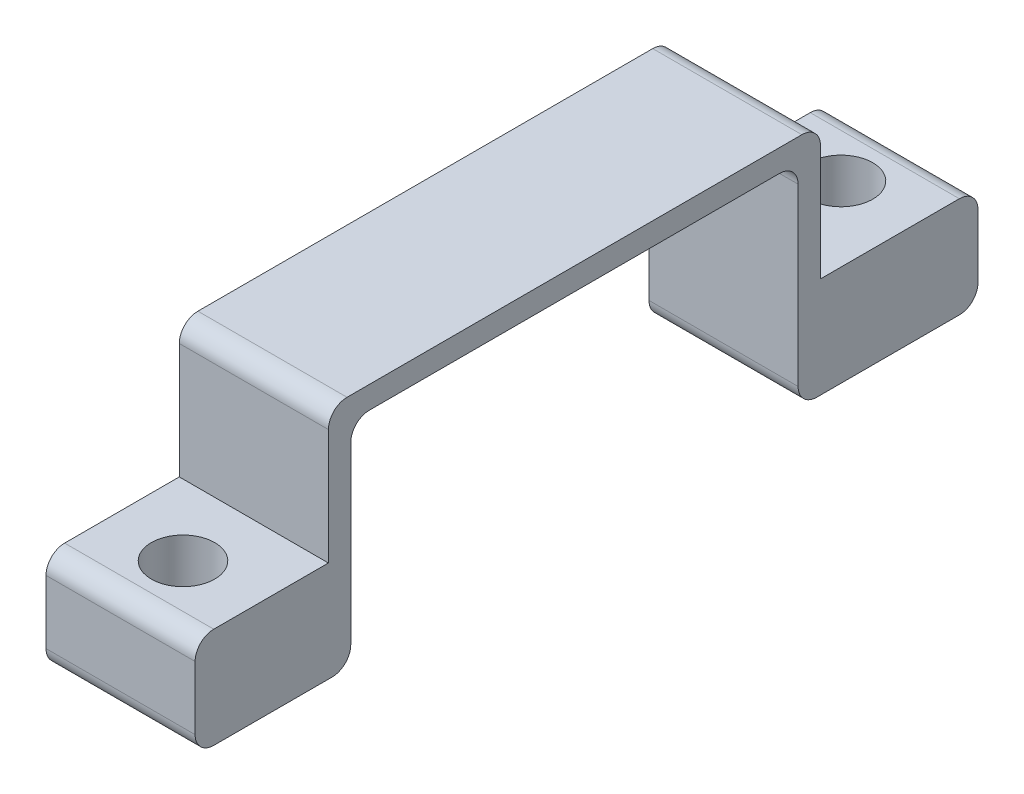
ISO-10303-21;
HEADER;
FILE_DESCRIPTION(('STEP AP214'),'2;1');
FILE_NAME('part.step','',(''),(''),'','','');
FILE_SCHEMA(('AUTOMOTIVE_DESIGN { 1 0 10303 214 1 1 1 1 }'));
ENDSEC;
DATA;
#1=APPLICATION_CONTEXT('core data for automotive mechanical design processes');
#2=APPLICATION_PROTOCOL_DEFINITION('international standard','automotive_design',2000,#1);
#3=PRODUCT_CONTEXT('',#1,'mechanical');
#4=PRODUCT('Part','Part','',(#3));
#5=PRODUCT_RELATED_PRODUCT_CATEGORY('part','',(#4));
#6=PRODUCT_DEFINITION_FORMATION('','',#4);
#7=PRODUCT_DEFINITION_CONTEXT('part definition',#1,'design');
#8=PRODUCT_DEFINITION('design','',#6,#7);
#9=PRODUCT_DEFINITION_SHAPE('','',#8);
#10=(LENGTH_UNIT() NAMED_UNIT(*) SI_UNIT(.MILLI.,.METRE.));
#11=(NAMED_UNIT(*) PLANE_ANGLE_UNIT() SI_UNIT($,.RADIAN.));
#12=(NAMED_UNIT(*) SI_UNIT($,.STERADIAN.) SOLID_ANGLE_UNIT());
#13=UNCERTAINTY_MEASURE_WITH_UNIT(LENGTH_MEASURE(1.E-05),#10,'distance_accuracy_value','');
#14=(GEOMETRIC_REPRESENTATION_CONTEXT(3) GLOBAL_UNCERTAINTY_ASSIGNED_CONTEXT((#13)) GLOBAL_UNIT_ASSIGNED_CONTEXT((#10,
#11,#12)) REPRESENTATION_CONTEXT('',''));
#15=CARTESIAN_POINT('',(0.,0.,0.));
#16=DIRECTION('',(0.,0.,1.));
#17=DIRECTION('',(1.,0.,0.));
#18=AXIS2_PLACEMENT_3D('',#15,#16,#17);
#19=CARTESIAN_POINT('',(-32.5,15.3,102.65));
#20=DIRECTION('',(0.,-1.,0.));
#21=DIRECTION('',(0.,0.,-1.));
#22=AXIS2_PLACEMENT_3D('',#19,#20,#21);
#23=PLANE('',#22);
#24=CARTESIAN_POINT('',(-21.9999999999999,15.3,96.3499999999999));
#25=DIRECTION('',(0.,-1.,0.));
#26=DIRECTION('',(0.,0.,-1.));
#27=AXIS2_PLACEMENT_3D('',#24,#25,#26);
#28=CIRCLE('',#27,1.7);
#29=CARTESIAN_POINT('',(-21.9999999999999,15.3,94.6499999999999));
#30=VERTEX_POINT('',#29);
#31=EDGE_CURVE('E227',#30,#30,#28,.F.);
#32=ORIENTED_EDGE('',*,*,#31,.F.);
#33=EDGE_LOOP('',(#32));
#34=FACE_BOUND('',#33,.T.);
#35=DIRECTION('',(0.,0.,-1.));
#36=VECTOR('',#35,1.);
#37=CARTESIAN_POINT('',(-17.9999999999999,15.3,102.65));
#38=LINE('',#37,#36);
#39=CARTESIAN_POINT('',(-17.9999999999999,15.3,101.45));
#40=VERTEX_POINT('',#39);
#41=CARTESIAN_POINT('',(-17.9999999999999,15.3,94.));
#42=VERTEX_POINT('',#41);
#43=EDGE_CURVE('E206',#40,#42,#38,.T.);
#44=ORIENTED_EDGE('',*,*,#43,.T.);
#45=DIRECTION('',(1.,0.,0.));
#46=VECTOR('',#45,1.);
#47=CARTESIAN_POINT('',(-25.9999999999999,15.3,94.));
#48=LINE('',#47,#46);
#49=CARTESIAN_POINT('',(-25.9999999999999,15.3,94.));
#50=VERTEX_POINT('',#49);
#51=EDGE_CURVE('E305',#42,#50,#48,.F.);
#52=ORIENTED_EDGE('',*,*,#51,.T.);
#53=DIRECTION('',(0.,0.,1.));
#54=VECTOR('',#53,1.);
#55=CARTESIAN_POINT('',(-25.9999999999999,15.3,102.65));
#56=LINE('',#55,#54);
#57=CARTESIAN_POINT('',(-25.9999999999999,15.3,101.45));
#58=VERTEX_POINT('',#57);
#59=EDGE_CURVE('E235',#50,#58,#56,.T.);
#60=ORIENTED_EDGE('',*,*,#59,.T.);
#61=DIRECTION('',(1.,0.,0.));
#62=VECTOR('',#61,1.);
#63=CARTESIAN_POINT('',(-32.5,15.3,101.45));
#64=LINE('',#63,#62);
#65=EDGE_CURVE('E213',#58,#40,#64,.T.);
#66=ORIENTED_EDGE('',*,*,#65,.T.);
#67=EDGE_LOOP('',(#44,#52,#60,#66));
#68=FACE_BOUND('',#67,.T.);
#69=ADVANCED_FACE('F36',(#34,#68),#23,.F.);
#70=CARTESIAN_POINT('',(-32.5,9.49999999999998,93.));
#71=DIRECTION('',(0.,0.,-1.));
#72=DIRECTION('',(-1.,0.,0.));
#73=AXIS2_PLACEMENT_3D('',#70,#71,#72);
#74=PLANE('',#73);
#75=DIRECTION('',(0.,-1.,0.));
#76=VECTOR('',#75,1.);
#77=CARTESIAN_POINT('',(-17.9999999999999,9.49999999999998,93.));
#78=LINE('',#77,#76);
#79=CARTESIAN_POINT('',(-17.9999999999999,14.3,93.));
#80=VERTEX_POINT('',#79);
#81=CARTESIAN_POINT('',(-17.9999999999999,10.9,93.));
#82=VERTEX_POINT('',#81);
#83=EDGE_CURVE('E383',#80,#82,#78,.T.);
#84=ORIENTED_EDGE('',*,*,#83,.T.);
#85=DIRECTION('',(1.,0.,0.));
#86=VECTOR('',#85,1.);
#87=CARTESIAN_POINT('',(-32.5,10.9,93.));
#88=LINE('',#87,#86);
#89=CARTESIAN_POINT('',(-25.9999999999999,10.9,93.));
#90=VERTEX_POINT('',#89);
#91=EDGE_CURVE('E51',#82,#90,#88,.F.);
#92=ORIENTED_EDGE('',*,*,#91,.T.);
#93=DIRECTION('',(0.,-1.,0.));
#94=VECTOR('',#93,1.);
#95=CARTESIAN_POINT('',(-25.9999999999999,9.49999999999998,93.));
#96=LINE('',#95,#94);
#97=CARTESIAN_POINT('',(-25.9999999999999,14.3,93.));
#98=VERTEX_POINT('',#97);
#99=EDGE_CURVE('E233',#98,#90,#96,.T.);
#100=ORIENTED_EDGE('',*,*,#99,.F.);
#101=DIRECTION('',(1.,0.,0.));
#102=VECTOR('',#101,1.);
#103=CARTESIAN_POINT('',(-17.9999999999999,14.3,93.));
#104=LINE('',#103,#102);
#105=EDGE_CURVE('E301',#98,#80,#104,.T.);
#106=ORIENTED_EDGE('',*,*,#105,.T.);
#107=EDGE_LOOP('',(#84,#92,#100,#106));
#108=FACE_BOUND('',#107,.T.);
#109=ADVANCED_FACE('F430',(#108),#74,.T.);
#110=CARTESIAN_POINT('',(-32.5,9.89999999999998,102.65));
#111=DIRECTION('',(0.,-1.,0.));
#112=DIRECTION('',(0.,0.,-1.));
#113=AXIS2_PLACEMENT_3D('',#110,#111,#112);
#114=PLANE('',#113);
#115=CARTESIAN_POINT('',(-21.9999999999999,9.89999999999998,96.3499999999999));
#116=DIRECTION('',(0.,-1.,0.));
#117=DIRECTION('',(0.,0.,-1.));
#118=AXIS2_PLACEMENT_3D('',#115,#116,#117);
#119=CIRCLE('',#118,1.7);
#120=CARTESIAN_POINT('',(-21.9999999999999,9.89999999999998,94.6499999999999));
#121=VERTEX_POINT('',#120);
#122=EDGE_CURVE('E230',#121,#121,#119,.F.);
#123=ORIENTED_EDGE('',*,*,#122,.T.);
#124=EDGE_LOOP('',(#123));
#125=FACE_BOUND('',#124,.T.);
#126=DIRECTION('',(0.,0.,1.));
#127=VECTOR('',#126,1.);
#128=CARTESIAN_POINT('',(-25.9999999999999,9.89999999999998,102.65));
#129=LINE('',#128,#127);
#130=CARTESIAN_POINT('',(-25.9999999999999,9.89999999999998,94.));
#131=VERTEX_POINT('',#130);
#132=CARTESIAN_POINT('',(-25.9999999999999,9.89999999999998,101.65));
#133=VERTEX_POINT('',#132);
#134=EDGE_CURVE('E218',#131,#133,#129,.T.);
#135=ORIENTED_EDGE('',*,*,#134,.F.);
#136=DIRECTION('',(1.,0.,0.));
#137=VECTOR('',#136,1.);
#138=CARTESIAN_POINT('',(-32.5,9.89999999999998,94.));
#139=LINE('',#138,#137);
#140=CARTESIAN_POINT('',(-17.9999999999999,9.89999999999998,94.));
#141=VERTEX_POINT('',#140);
#142=EDGE_CURVE('E298',#131,#141,#139,.T.);
#143=ORIENTED_EDGE('',*,*,#142,.T.);
#144=DIRECTION('',(0.,0.,-1.));
#145=VECTOR('',#144,1.);
#146=CARTESIAN_POINT('',(-17.9999999999999,9.89999999999998,102.65));
#147=LINE('',#146,#145);
#148=CARTESIAN_POINT('',(-17.9999999999999,9.89999999999998,101.65));
#149=VERTEX_POINT('',#148);
#150=EDGE_CURVE('E237',#149,#141,#147,.T.);
#151=ORIENTED_EDGE('',*,*,#150,.F.);
#152=DIRECTION('',(1.,0.,0.));
#153=VECTOR('',#152,1.);
#154=CARTESIAN_POINT('',(-32.5,9.89999999999998,101.65));
#155=LINE('',#154,#153);
#156=EDGE_CURVE('E296',#149,#133,#155,.F.);
#157=ORIENTED_EDGE('',*,*,#156,.T.);
#158=EDGE_LOOP('',(#135,#143,#151,#157));
#159=FACE_BOUND('',#158,.T.);
#160=ADVANCED_FACE('F436',(#125,#159),#114,.T.);
#161=CARTESIAN_POINT('',(-32.5,21.3,102.65));
#162=DIRECTION('',(0.,0.,1.));
#163=DIRECTION('',(1.,0.,0.));
#164=AXIS2_PLACEMENT_3D('',#161,#162,#163);
#165=PLANE('',#164);
#166=DIRECTION('',(0.,1.,0.));
#167=VECTOR('',#166,1.);
#168=CARTESIAN_POINT('',(-25.9999999999999,21.3,102.65));
#169=LINE('',#168,#167);
#170=CARTESIAN_POINT('',(-25.9999999999999,10.9,102.65));
#171=VERTEX_POINT('',#170);
#172=CARTESIAN_POINT('',(-25.9999999999999,20.3,102.65));
#173=VERTEX_POINT('',#172);
#174=EDGE_CURVE('E251',#171,#173,#169,.T.);
#175=ORIENTED_EDGE('',*,*,#174,.F.);
#176=DIRECTION('',(1.,0.,0.));
#177=VECTOR('',#176,1.);
#178=CARTESIAN_POINT('',(-32.5,10.9,102.65));
#179=LINE('',#178,#177);
#180=CARTESIAN_POINT('',(-17.9999999999999,10.9,102.65));
#181=VERTEX_POINT('',#180);
#182=EDGE_CURVE('E314',#171,#181,#179,.T.);
#183=ORIENTED_EDGE('',*,*,#182,.T.);
#184=DIRECTION('',(0.,-1.,0.));
#185=VECTOR('',#184,1.);
#186=CARTESIAN_POINT('',(-17.9999999999999,21.3,102.65));
#187=LINE('',#186,#185);
#188=CARTESIAN_POINT('',(-17.9999999999999,20.3,102.65));
#189=VERTEX_POINT('',#188);
#190=EDGE_CURVE('E254',#189,#181,#187,.T.);
#191=ORIENTED_EDGE('',*,*,#190,.F.);
#192=DIRECTION('',(1.,0.,0.));
#193=VECTOR('',#192,1.);
#194=CARTESIAN_POINT('',(-25.9999999999999,20.3,102.65));
#195=LINE('',#194,#193);
#196=EDGE_CURVE('E312',#189,#173,#195,.F.);
#197=ORIENTED_EDGE('',*,*,#196,.T.);
#198=EDGE_LOOP('',(#175,#183,#191,#197));
#199=FACE_BOUND('',#198,.T.);
#200=ADVANCED_FACE('F345',(#199),#165,.T.);
#201=CARTESIAN_POINT('',(-32.5,21.3,102.65));
#202=DIRECTION('',(0.,-1.,0.));
#203=DIRECTION('',(0.,0.,-1.));
#204=AXIS2_PLACEMENT_3D('',#201,#202,#203);
#205=PLANE('',#204);
#206=DIRECTION('',(0.,0.,-1.));
#207=VECTOR('',#206,1.);
#208=CARTESIAN_POINT('',(-17.9999999999999,21.3,102.65));
#209=LINE('',#208,#207);
#210=CARTESIAN_POINT('',(-17.9999999999999,21.3,125.65));
#211=VERTEX_POINT('',#210);
#212=CARTESIAN_POINT('',(-17.9999999999999,21.3,103.65));
#213=VERTEX_POINT('',#212);
#214=EDGE_CURVE('E339',#211,#213,#209,.T.);
#215=ORIENTED_EDGE('',*,*,#214,.F.);
#216=DIRECTION('',(1.,0.,0.));
#217=VECTOR('',#216,1.);
#218=CARTESIAN_POINT('',(-25.9999999999999,21.3,125.65));
#219=LINE('',#218,#217);
#220=CARTESIAN_POINT('',(-25.9999999999999,21.3,125.65));
#221=VERTEX_POINT('',#220);
#222=EDGE_CURVE('E320',#211,#221,#219,.F.);
#223=ORIENTED_EDGE('',*,*,#222,.T.);
#224=DIRECTION('',(0.,0.,1.));
#225=VECTOR('',#224,1.);
#226=CARTESIAN_POINT('',(-25.9999999999999,21.3,102.65));
#227=LINE('',#226,#225);
#228=CARTESIAN_POINT('',(-25.9999999999999,21.3,103.65));
#229=VERTEX_POINT('',#228);
#230=EDGE_CURVE('E354',#229,#221,#227,.T.);
#231=ORIENTED_EDGE('',*,*,#230,.F.);
#232=DIRECTION('',(1.,0.,0.));
#233=VECTOR('',#232,1.);
#234=CARTESIAN_POINT('',(-17.9999999999999,21.3,103.65));
#235=LINE('',#234,#233);
#236=EDGE_CURVE('E317',#229,#213,#235,.T.);
#237=ORIENTED_EDGE('',*,*,#236,.T.);
#238=EDGE_LOOP('',(#215,#223,#231,#237));
#239=FACE_BOUND('',#238,.T.);
#240=ADVANCED_FACE('F357',(#239),#205,.T.);
#241=CARTESIAN_POINT('',(-32.5,21.3,126.65));
#242=DIRECTION('',(0.,0.,-1.));
#243=DIRECTION('',(-1.,0.,0.));
#244=AXIS2_PLACEMENT_3D('',#241,#242,#243);
#245=PLANE('',#244);
#246=DIRECTION('',(0.,1.,0.));
#247=VECTOR('',#246,1.);
#248=CARTESIAN_POINT('',(-17.9999999999999,21.3,126.65));
#249=LINE('',#248,#247);
#250=CARTESIAN_POINT('',(-17.9999999999999,10.9,126.65));
#251=VERTEX_POINT('',#250);
#252=CARTESIAN_POINT('',(-17.9999999999999,20.3,126.65));
#253=VERTEX_POINT('',#252);
#254=EDGE_CURVE('E245',#251,#253,#249,.T.);
#255=ORIENTED_EDGE('',*,*,#254,.F.);
#256=DIRECTION('',(1.,0.,0.));
#257=VECTOR('',#256,1.);
#258=CARTESIAN_POINT('',(-32.5,10.9,126.65));
#259=LINE('',#258,#257);
#260=CARTESIAN_POINT('',(-25.9999999999999,10.9,126.65));
#261=VERTEX_POINT('',#260);
#262=EDGE_CURVE('E310',#251,#261,#259,.F.);
#263=ORIENTED_EDGE('',*,*,#262,.T.);
#264=DIRECTION('',(0.,-1.,0.));
#265=VECTOR('',#264,1.);
#266=CARTESIAN_POINT('',(-25.9999999999999,21.3,126.65));
#267=LINE('',#266,#265);
#268=CARTESIAN_POINT('',(-25.9999999999999,20.3,126.65));
#269=VERTEX_POINT('',#268);
#270=EDGE_CURVE('E242',#269,#261,#267,.T.);
#271=ORIENTED_EDGE('',*,*,#270,.F.);
#272=DIRECTION('',(1.,0.,0.));
#273=VECTOR('',#272,1.);
#274=CARTESIAN_POINT('',(-17.9999999999999,20.3,126.65));
#275=LINE('',#274,#273);
#276=EDGE_CURVE('E307',#269,#253,#275,.T.);
#277=ORIENTED_EDGE('',*,*,#276,.T.);
#278=EDGE_LOOP('',(#255,#263,#271,#277));
#279=FACE_BOUND('',#278,.T.);
#280=ADVANCED_FACE('F399',(#279),#245,.T.);
#281=CARTESIAN_POINT('',(-32.5,9.89999999999998,126.65));
#282=DIRECTION('',(0.,-1.,0.));
#283=DIRECTION('',(0.,0.,-1.));
#284=AXIS2_PLACEMENT_3D('',#281,#282,#283);
#285=PLANE('',#284);
#286=CARTESIAN_POINT('',(-21.9999999999999,9.89999999999998,131.65));
#287=DIRECTION('',(0.,-1.,0.));
#288=DIRECTION('',(0.,0.,-1.));
#289=AXIS2_PLACEMENT_3D('',#286,#287,#288);
#290=CIRCLE('',#289,1.7);
#291=CARTESIAN_POINT('',(-21.9999999999999,9.89999999999998,129.95));
#292=VERTEX_POINT('',#291);
#293=EDGE_CURVE('E231',#292,#292,#290,.F.);
#294=ORIENTED_EDGE('',*,*,#293,.T.);
#295=EDGE_LOOP('',(#294));
#296=FACE_BOUND('',#295,.T.);
#297=DIRECTION('',(0.,0.,-1.));
#298=VECTOR('',#297,1.);
#299=CARTESIAN_POINT('',(-17.9999999999999,9.89999999999998,126.65));
#300=LINE('',#299,#298);
#301=CARTESIAN_POINT('',(-17.9999999999999,9.89999999999998,134.));
#302=VERTEX_POINT('',#301);
#303=CARTESIAN_POINT('',(-17.9999999999999,9.89999999999998,127.65));
#304=VERTEX_POINT('',#303);
#305=EDGE_CURVE('E196',#302,#304,#300,.T.);
#306=ORIENTED_EDGE('',*,*,#305,.F.);
#307=DIRECTION('',(1.,0.,0.));
#308=VECTOR('',#307,1.);
#309=CARTESIAN_POINT('',(-32.5,9.89999999999998,134.));
#310=LINE('',#309,#308);
#311=CARTESIAN_POINT('',(-25.9999999999999,9.89999999999998,134.));
#312=VERTEX_POINT('',#311);
#313=EDGE_CURVE('E278',#302,#312,#310,.F.);
#314=ORIENTED_EDGE('',*,*,#313,.T.);
#315=DIRECTION('',(0.,0.,1.));
#316=VECTOR('',#315,1.);
#317=CARTESIAN_POINT('',(-25.9999999999999,9.89999999999998,126.65));
#318=LINE('',#317,#316);
#319=CARTESIAN_POINT('',(-25.9999999999999,9.89999999999998,127.65));
#320=VERTEX_POINT('',#319);
#321=EDGE_CURVE('E226',#320,#312,#318,.T.);
#322=ORIENTED_EDGE('',*,*,#321,.F.);
#323=DIRECTION('',(1.,0.,0.));
#324=VECTOR('',#323,1.);
#325=CARTESIAN_POINT('',(-32.5,9.89999999999998,127.65));
#326=LINE('',#325,#324);
#327=EDGE_CURVE('E275',#320,#304,#326,.T.);
#328=ORIENTED_EDGE('',*,*,#327,.T.);
#329=EDGE_LOOP('',(#306,#314,#322,#328));
#330=FACE_BOUND('',#329,.T.);
#331=ADVANCED_FACE('F410',(#296,#330),#285,.T.);
#332=CARTESIAN_POINT('',(-32.5,10.7,135.));
#333=DIRECTION('',(0.,0.,1.));
#334=DIRECTION('',(1.,0.,0.));
#335=AXIS2_PLACEMENT_3D('',#332,#333,#334);
#336=PLANE('',#335);
#337=DIRECTION('',(0.,-1.,0.));
#338=VECTOR('',#337,1.);
#339=CARTESIAN_POINT('',(-25.9999999999999,9.49999999999998,135.));
#340=LINE('',#339,#338);
#341=CARTESIAN_POINT('',(-25.9999999999999,14.3,135.));
#342=VERTEX_POINT('',#341);
#343=CARTESIAN_POINT('',(-25.9999999999999,10.9,135.));
#344=VERTEX_POINT('',#343);
#345=EDGE_CURVE('E390',#342,#344,#340,.T.);
#346=ORIENTED_EDGE('',*,*,#345,.T.);
#347=DIRECTION('',(1.,0.,0.));
#348=VECTOR('',#347,1.);
#349=CARTESIAN_POINT('',(-32.5,10.9,135.));
#350=LINE('',#349,#348);
#351=CARTESIAN_POINT('',(-17.9999999999999,10.9,135.));
#352=VERTEX_POINT('',#351);
#353=EDGE_CURVE('E257',#344,#352,#350,.T.);
#354=ORIENTED_EDGE('',*,*,#353,.T.);
#355=DIRECTION('',(0.,-1.,0.));
#356=VECTOR('',#355,1.);
#357=CARTESIAN_POINT('',(-17.9999999999999,9.49999999999998,135.));
#358=LINE('',#357,#356);
#359=CARTESIAN_POINT('',(-17.9999999999999,14.3,135.));
#360=VERTEX_POINT('',#359);
#361=EDGE_CURVE('E385',#360,#352,#358,.T.);
#362=ORIENTED_EDGE('',*,*,#361,.F.);
#363=DIRECTION('',(1.,0.,0.));
#364=VECTOR('',#363,1.);
#365=CARTESIAN_POINT('',(-25.9999999999999,14.3,135.));
#366=LINE('',#365,#364);
#367=EDGE_CURVE('E255',#360,#342,#366,.F.);
#368=ORIENTED_EDGE('',*,*,#367,.T.);
#369=EDGE_LOOP('',(#346,#354,#362,#368));
#370=FACE_BOUND('',#369,.T.);
#371=ADVANCED_FACE('F418',(#370),#336,.T.);
#372=CARTESIAN_POINT('',(-32.5,15.3,126.65));
#373=DIRECTION('',(0.,-1.,0.));
#374=DIRECTION('',(0.,0.,-1.));
#375=AXIS2_PLACEMENT_3D('',#372,#373,#374);
#376=PLANE('',#375);
#377=CARTESIAN_POINT('',(-21.9999999999999,15.3,131.65));
#378=DIRECTION('',(0.,-1.,0.));
#379=DIRECTION('',(0.,0.,-1.));
#380=AXIS2_PLACEMENT_3D('',#377,#378,#379);
#381=CIRCLE('',#380,1.7);
#382=CARTESIAN_POINT('',(-21.9999999999999,15.3,129.95));
#383=VERTEX_POINT('',#382);
#384=EDGE_CURVE('E221',#383,#383,#381,.F.);
#385=ORIENTED_EDGE('',*,*,#384,.F.);
#386=EDGE_LOOP('',(#385));
#387=FACE_BOUND('',#386,.T.);
#388=DIRECTION('',(0.,0.,1.));
#389=VECTOR('',#388,1.);
#390=CARTESIAN_POINT('',(-25.9999999999999,15.3,126.65));
#391=LINE('',#390,#389);
#392=CARTESIAN_POINT('',(-25.9999999999999,15.3,127.85));
#393=VERTEX_POINT('',#392);
#394=CARTESIAN_POINT('',(-25.9999999999999,15.3,134.));
#395=VERTEX_POINT('',#394);
#396=EDGE_CURVE('E224',#393,#395,#391,.T.);
#397=ORIENTED_EDGE('',*,*,#396,.T.);
#398=DIRECTION('',(1.,0.,0.));
#399=VECTOR('',#398,1.);
#400=CARTESIAN_POINT('',(-17.9999999999999,15.3,134.));
#401=LINE('',#400,#399);
#402=CARTESIAN_POINT('',(-17.9999999999999,15.3,134.));
#403=VERTEX_POINT('',#402);
#404=EDGE_CURVE('E194',#395,#403,#401,.T.);
#405=ORIENTED_EDGE('',*,*,#404,.T.);
#406=DIRECTION('',(0.,0.,-1.));
#407=VECTOR('',#406,1.);
#408=CARTESIAN_POINT('',(-17.9999999999999,15.3,126.65));
#409=LINE('',#408,#407);
#410=CARTESIAN_POINT('',(-17.9999999999999,15.3,127.85));
#411=VERTEX_POINT('',#410);
#412=EDGE_CURVE('E187',#403,#411,#409,.T.);
#413=ORIENTED_EDGE('',*,*,#412,.T.);
#414=DIRECTION('',(1.,0.,0.));
#415=VECTOR('',#414,1.);
#416=CARTESIAN_POINT('',(-32.5,15.3,127.85));
#417=LINE('',#416,#415);
#418=EDGE_CURVE('E192',#393,#411,#417,.T.);
#419=ORIENTED_EDGE('',*,*,#418,.F.);
#420=EDGE_LOOP('',(#397,#405,#413,#419));
#421=FACE_BOUND('',#420,.T.);
#422=ADVANCED_FACE('F190',(#387,#421),#376,.F.);
#423=CARTESIAN_POINT('',(-32.5,21.3,127.85));
#424=DIRECTION('',(0.,0.,-1.));
#425=DIRECTION('',(-1.,0.,0.));
#426=AXIS2_PLACEMENT_3D('',#423,#424,#425);
#427=PLANE('',#426);
#428=DIRECTION('',(0.,1.,0.));
#429=VECTOR('',#428,1.);
#430=CARTESIAN_POINT('',(-17.9999999999999,21.3,127.85));
#431=LINE('',#430,#429);
#432=CARTESIAN_POINT('',(-17.9999999999999,21.5,127.85));
#433=VERTEX_POINT('',#432);
#434=EDGE_CURVE('E197',#411,#433,#431,.T.);
#435=ORIENTED_EDGE('',*,*,#434,.T.);
#436=DIRECTION('',(1.,0.,0.));
#437=VECTOR('',#436,1.);
#438=CARTESIAN_POINT('',(-32.5,21.5,127.85));
#439=LINE('',#438,#437);
#440=CARTESIAN_POINT('',(-25.9999999999999,21.5,127.85));
#441=VERTEX_POINT('',#440);
#442=EDGE_CURVE('E330',#433,#441,#439,.F.);
#443=ORIENTED_EDGE('',*,*,#442,.T.);
#444=DIRECTION('',(0.,-1.,0.));
#445=VECTOR('',#444,1.);
#446=CARTESIAN_POINT('',(-25.9999999999999,21.3,127.85));
#447=LINE('',#446,#445);
#448=EDGE_CURVE('E210',#441,#393,#447,.T.);
#449=ORIENTED_EDGE('',*,*,#448,.T.);
#450=ORIENTED_EDGE('',*,*,#418,.T.);
#451=EDGE_LOOP('',(#435,#443,#449,#450));
#452=FACE_BOUND('',#451,.T.);
#453=ADVANCED_FACE('F208',(#452),#427,.F.);
#454=CARTESIAN_POINT('',(-32.5,22.5,102.65));
#455=DIRECTION('',(0.,-1.,0.));
#456=DIRECTION('',(0.,0.,-1.));
#457=AXIS2_PLACEMENT_3D('',#454,#455,#456);
#458=PLANE('',#457);
#459=DIRECTION('',(0.,0.,-1.));
#460=VECTOR('',#459,1.);
#461=CARTESIAN_POINT('',(-17.9999999999999,22.5,93.));
#462=LINE('',#461,#460);
#463=CARTESIAN_POINT('',(-17.9999999999999,22.5,126.85));
#464=VERTEX_POINT('',#463);
#465=CARTESIAN_POINT('',(-17.9999999999999,22.5,102.45));
#466=VERTEX_POINT('',#465);
#467=EDGE_CURVE('E376',#464,#466,#462,.T.);
#468=ORIENTED_EDGE('',*,*,#467,.T.);
#469=DIRECTION('',(1.,0.,0.));
#470=VECTOR('',#469,1.);
#471=CARTESIAN_POINT('',(-32.5,22.5,102.45));
#472=LINE('',#471,#470);
#473=CARTESIAN_POINT('',(-25.9999999999999,22.5,102.45));
#474=VERTEX_POINT('',#473);
#475=EDGE_CURVE('E328',#466,#474,#472,.F.);
#476=ORIENTED_EDGE('',*,*,#475,.T.);
#477=DIRECTION('',(0.,0.,1.));
#478=VECTOR('',#477,1.);
#479=CARTESIAN_POINT('',(-25.9999999999999,22.5,93.));
#480=LINE('',#479,#478);
#481=CARTESIAN_POINT('',(-25.9999999999999,22.5,126.85));
#482=VERTEX_POINT('',#481);
#483=EDGE_CURVE('E248',#474,#482,#480,.T.);
#484=ORIENTED_EDGE('',*,*,#483,.T.);
#485=DIRECTION('',(1.,0.,0.));
#486=VECTOR('',#485,1.);
#487=CARTESIAN_POINT('',(-32.5,22.5,126.85));
#488=LINE('',#487,#486);
#489=EDGE_CURVE('E325',#482,#464,#488,.T.);
#490=ORIENTED_EDGE('',*,*,#489,.T.);
#491=EDGE_LOOP('',(#468,#476,#484,#490));
#492=FACE_BOUND('',#491,.T.);
#493=ADVANCED_FACE('F379',(#492),#458,.F.);
#494=CARTESIAN_POINT('',(-32.5,21.3,101.45));
#495=DIRECTION('',(0.,0.,1.));
#496=DIRECTION('',(1.,0.,0.));
#497=AXIS2_PLACEMENT_3D('',#494,#495,#496);
#498=PLANE('',#497);
#499=DIRECTION('',(0.,1.,0.));
#500=VECTOR('',#499,1.);
#501=CARTESIAN_POINT('',(-25.9999999999999,21.3,101.45));
#502=LINE('',#501,#500);
#503=CARTESIAN_POINT('',(-25.9999999999999,21.5,101.45));
#504=VERTEX_POINT('',#503);
#505=EDGE_CURVE('E215',#58,#504,#502,.T.);
#506=ORIENTED_EDGE('',*,*,#505,.T.);
#507=DIRECTION('',(1.,0.,0.));
#508=VECTOR('',#507,1.);
#509=CARTESIAN_POINT('',(-32.5,21.5,101.45));
#510=LINE('',#509,#508);
#511=CARTESIAN_POINT('',(-17.9999999999999,21.5,101.45));
#512=VERTEX_POINT('',#511);
#513=EDGE_CURVE('E322',#504,#512,#510,.T.);
#514=ORIENTED_EDGE('',*,*,#513,.T.);
#515=DIRECTION('',(0.,-1.,0.));
#516=VECTOR('',#515,1.);
#517=CARTESIAN_POINT('',(-17.9999999999999,21.3,101.45));
#518=LINE('',#517,#516);
#519=EDGE_CURVE('E212',#512,#40,#518,.T.);
#520=ORIENTED_EDGE('',*,*,#519,.T.);
#521=ORIENTED_EDGE('',*,*,#65,.F.);
#522=EDGE_LOOP('',(#506,#514,#520,#521));
#523=FACE_BOUND('',#522,.T.);
#524=ADVANCED_FACE('F369',(#523),#498,.F.);
#525=CARTESIAN_POINT('',(-17.9999999999999,9.49999999999998,93.));
#526=DIRECTION('',(-1.,0.,0.));
#527=DIRECTION('',(0.,0.,1.));
#528=AXIS2_PLACEMENT_3D('',#525,#526,#527);
#529=PLANE('',#528);
#530=ORIENTED_EDGE('',*,*,#361,.T.);
#531=CARTESIAN_POINT('',(-17.9999999999999,10.9,134.));
#532=DIRECTION('',(-1.,0.,0.));
#533=DIRECTION('',(0.,0.,1.));
#534=AXIS2_PLACEMENT_3D('',#531,#532,#533);
#535=CIRCLE('',#534,1.);
#536=EDGE_CURVE('E273',#352,#302,#535,.F.);
#537=ORIENTED_EDGE('',*,*,#536,.T.);
#538=ORIENTED_EDGE('',*,*,#305,.T.);
#539=CARTESIAN_POINT('',(-17.9999999999999,10.9,127.65));
#540=DIRECTION('',(-1.,0.,0.));
#541=DIRECTION('',(0.,0.,1.));
#542=AXIS2_PLACEMENT_3D('',#539,#540,#541);
#543=CIRCLE('',#542,1.);
#544=EDGE_CURVE('E265',#304,#251,#543,.F.);
#545=ORIENTED_EDGE('',*,*,#544,.T.);
#546=ORIENTED_EDGE('',*,*,#254,.T.);
#547=CARTESIAN_POINT('',(-17.9999999999999,20.3,125.65));
#548=DIRECTION('',(-1.,0.,0.));
#549=DIRECTION('',(0.,0.,1.));
#550=AXIS2_PLACEMENT_3D('',#547,#548,#549);
#551=CIRCLE('',#550,1.);
#552=EDGE_CURVE('E332',#253,#211,#551,.T.);
#553=ORIENTED_EDGE('',*,*,#552,.T.);
#554=ORIENTED_EDGE('',*,*,#214,.T.);
#555=CARTESIAN_POINT('',(-17.9999999999999,20.3,103.65));
#556=DIRECTION('',(-1.,0.,0.));
#557=DIRECTION('',(0.,0.,1.));
#558=AXIS2_PLACEMENT_3D('',#555,#556,#557);
#559=CIRCLE('',#558,1.);
#560=EDGE_CURVE('E44',#213,#189,#559,.T.);
#561=ORIENTED_EDGE('',*,*,#560,.T.);
#562=ORIENTED_EDGE('',*,*,#190,.T.);
#563=CARTESIAN_POINT('',(-17.9999999999999,10.9,101.65));
#564=DIRECTION('',(-1.,0.,0.));
#565=DIRECTION('',(0.,0.,1.));
#566=AXIS2_PLACEMENT_3D('',#563,#564,#565);
#567=CIRCLE('',#566,1.);
#568=EDGE_CURVE('E263',#181,#149,#567,.F.);
#569=ORIENTED_EDGE('',*,*,#568,.T.);
#570=ORIENTED_EDGE('',*,*,#150,.T.);
#571=CARTESIAN_POINT('',(-17.9999999999999,10.9,94.));
#572=DIRECTION('',(-1.,0.,0.));
#573=DIRECTION('',(0.,0.,1.));
#574=AXIS2_PLACEMENT_3D('',#571,#572,#573);
#575=CIRCLE('',#574,1.);
#576=EDGE_CURVE('E269',#141,#82,#575,.F.);
#577=ORIENTED_EDGE('',*,*,#576,.T.);
#578=ORIENTED_EDGE('',*,*,#83,.F.);
#579=CARTESIAN_POINT('',(-17.9999999999999,14.3,94.));
#580=DIRECTION('',(-1.,0.,0.));
#581=DIRECTION('',(0.,0.,1.));
#582=AXIS2_PLACEMENT_3D('',#579,#580,#581);
#583=CIRCLE('',#582,1.);
#584=EDGE_CURVE('E267',#80,#42,#583,.F.);
#585=ORIENTED_EDGE('',*,*,#584,.T.);
#586=ORIENTED_EDGE('',*,*,#43,.F.);
#587=ORIENTED_EDGE('',*,*,#519,.F.);
#588=CARTESIAN_POINT('',(-17.9999999999999,21.5,102.45));
#589=DIRECTION('',(-1.,0.,0.));
#590=DIRECTION('',(0.,0.,1.));
#591=AXIS2_PLACEMENT_3D('',#588,#589,#590);
#592=CIRCLE('',#591,1.);
#593=EDGE_CURVE('E261',#512,#466,#592,.F.);
#594=ORIENTED_EDGE('',*,*,#593,.T.);
#595=ORIENTED_EDGE('',*,*,#467,.F.);
#596=CARTESIAN_POINT('',(-17.9999999999999,21.5,126.85));
#597=DIRECTION('',(-1.,0.,0.));
#598=DIRECTION('',(0.,0.,1.));
#599=AXIS2_PLACEMENT_3D('',#596,#597,#598);
#600=CIRCLE('',#599,1.);
#601=EDGE_CURVE('E203',#464,#433,#600,.F.);
#602=ORIENTED_EDGE('',*,*,#601,.T.);
#603=ORIENTED_EDGE('',*,*,#434,.F.);
#604=ORIENTED_EDGE('',*,*,#412,.F.);
#605=CARTESIAN_POINT('',(-17.9999999999999,14.3,134.));
#606=DIRECTION('',(-1.,0.,0.));
#607=DIRECTION('',(0.,0.,1.));
#608=AXIS2_PLACEMENT_3D('',#605,#606,#607);
#609=CIRCLE('',#608,1.);
#610=EDGE_CURVE('E271',#403,#360,#609,.F.);
#611=ORIENTED_EDGE('',*,*,#610,.T.);
#612=EDGE_LOOP('',(#530,#537,#538,#545,#546,#553,#554,#561,#562,#569,#570,#577,#578,#585,#586,
#587,#594,#595,#602,#603,#604,#611));
#613=FACE_BOUND('',#612,.T.);
#614=ADVANCED_FACE('F201',(#613),#529,.F.);
#615=CARTESIAN_POINT('',(-25.9999999999999,9.49999999999998,93.));
#616=DIRECTION('',(1.,0.,0.));
#617=DIRECTION('',(0.,0.,-1.));
#618=AXIS2_PLACEMENT_3D('',#615,#616,#617);
#619=PLANE('',#618);
#620=ORIENTED_EDGE('',*,*,#321,.T.);
#621=CARTESIAN_POINT('',(-25.9999999999999,10.9,134.));
#622=DIRECTION('',(1.,0.,0.));
#623=DIRECTION('',(0.,0.,-1.));
#624=AXIS2_PLACEMENT_3D('',#621,#622,#623);
#625=CIRCLE('',#624,1.);
#626=EDGE_CURVE('E293',#312,#344,#625,.F.);
#627=ORIENTED_EDGE('',*,*,#626,.T.);
#628=ORIENTED_EDGE('',*,*,#345,.F.);
#629=CARTESIAN_POINT('',(-25.9999999999999,14.3,134.));
#630=DIRECTION('',(1.,0.,0.));
#631=DIRECTION('',(0.,0.,-1.));
#632=AXIS2_PLACEMENT_3D('',#629,#630,#631);
#633=CIRCLE('',#632,1.);
#634=EDGE_CURVE('E291',#342,#395,#633,.F.);
#635=ORIENTED_EDGE('',*,*,#634,.T.);
#636=ORIENTED_EDGE('',*,*,#396,.F.);
#637=ORIENTED_EDGE('',*,*,#448,.F.);
#638=CARTESIAN_POINT('',(-25.9999999999999,21.5,126.85));
#639=DIRECTION('',(1.,0.,0.));
#640=DIRECTION('',(0.,0.,-1.));
#641=AXIS2_PLACEMENT_3D('',#638,#639,#640);
#642=CIRCLE('',#641,1.);
#643=EDGE_CURVE('E280',#441,#482,#642,.F.);
#644=ORIENTED_EDGE('',*,*,#643,.T.);
#645=ORIENTED_EDGE('',*,*,#483,.F.);
#646=CARTESIAN_POINT('',(-25.9999999999999,21.5,102.45));
#647=DIRECTION('',(1.,0.,0.));
#648=DIRECTION('',(0.,0.,-1.));
#649=AXIS2_PLACEMENT_3D('',#646,#647,#648);
#650=CIRCLE('',#649,1.);
#651=EDGE_CURVE('E282',#474,#504,#650,.F.);
#652=ORIENTED_EDGE('',*,*,#651,.T.);
#653=ORIENTED_EDGE('',*,*,#505,.F.);
#654=ORIENTED_EDGE('',*,*,#59,.F.);
#655=CARTESIAN_POINT('',(-25.9999999999999,14.3,94.));
#656=DIRECTION('',(1.,0.,0.));
#657=DIRECTION('',(0.,0.,-1.));
#658=AXIS2_PLACEMENT_3D('',#655,#656,#657);
#659=CIRCLE('',#658,1.);
#660=EDGE_CURVE('E58',#50,#98,#659,.F.);
#661=ORIENTED_EDGE('',*,*,#660,.T.);
#662=ORIENTED_EDGE('',*,*,#99,.T.);
#663=CARTESIAN_POINT('',(-25.9999999999999,10.9,94.));
#664=DIRECTION('',(1.,0.,0.));
#665=DIRECTION('',(0.,0.,-1.));
#666=AXIS2_PLACEMENT_3D('',#663,#664,#665);
#667=CIRCLE('',#666,1.);
#668=EDGE_CURVE('E289',#90,#131,#667,.F.);
#669=ORIENTED_EDGE('',*,*,#668,.T.);
#670=ORIENTED_EDGE('',*,*,#134,.T.);
#671=CARTESIAN_POINT('',(-25.9999999999999,10.9,101.65));
#672=DIRECTION('',(1.,0.,0.));
#673=DIRECTION('',(0.,0.,-1.));
#674=AXIS2_PLACEMENT_3D('',#671,#672,#673);
#675=CIRCLE('',#674,1.);
#676=EDGE_CURVE('E284',#133,#171,#675,.F.);
#677=ORIENTED_EDGE('',*,*,#676,.T.);
#678=ORIENTED_EDGE('',*,*,#174,.T.);
#679=CARTESIAN_POINT('',(-25.9999999999999,20.3,103.65));
#680=DIRECTION('',(1.,0.,0.));
#681=DIRECTION('',(0.,0.,-1.));
#682=AXIS2_PLACEMENT_3D('',#679,#680,#681);
#683=CIRCLE('',#682,1.);
#684=EDGE_CURVE('E13',#173,#229,#683,.T.);
#685=ORIENTED_EDGE('',*,*,#684,.T.);
#686=ORIENTED_EDGE('',*,*,#230,.T.);
#687=CARTESIAN_POINT('',(-25.9999999999999,20.3,125.65));
#688=DIRECTION('',(1.,0.,0.));
#689=DIRECTION('',(0.,0.,-1.));
#690=AXIS2_PLACEMENT_3D('',#687,#688,#689);
#691=CIRCLE('',#690,1.);
#692=EDGE_CURVE('E334',#221,#269,#691,.T.);
#693=ORIENTED_EDGE('',*,*,#692,.T.);
#694=ORIENTED_EDGE('',*,*,#270,.T.);
#695=CARTESIAN_POINT('',(-25.9999999999999,10.9,127.65));
#696=DIRECTION('',(1.,0.,0.));
#697=DIRECTION('',(0.,0.,-1.));
#698=AXIS2_PLACEMENT_3D('',#695,#696,#697);
#699=CIRCLE('',#698,1.);
#700=EDGE_CURVE('E286',#261,#320,#699,.F.);
#701=ORIENTED_EDGE('',*,*,#700,.T.);
#702=EDGE_LOOP('',(#620,#627,#628,#635,#636,#637,#644,#645,#652,#653,#654,#661,#662,#669,#670,
#677,#678,#685,#686,#693,#694,#701));
#703=FACE_BOUND('',#702,.T.);
#704=ADVANCED_FACE('F353',(#703),#619,.F.);
#705=CARTESIAN_POINT('',(-21.9999999999999,10.7000000000006,96.3499999999999));
#706=DIRECTION('',(0.,1.,0.));
#707=DIRECTION('',(0.,0.,1.));
#708=AXIS2_PLACEMENT_3D('',#705,#706,#707);
#709=CYLINDRICAL_SURFACE('',#708,1.7);
#710=ORIENTED_EDGE('',*,*,#122,.F.);
#711=EDGE_LOOP('',(#710));
#712=FACE_BOUND('',#711,.T.);
#713=ORIENTED_EDGE('',*,*,#31,.T.);
#714=EDGE_LOOP('',(#713));
#715=FACE_BOUND('',#714,.T.);
#716=ADVANCED_FACE('F531',(#712,#715),#709,.F.);
#717=CARTESIAN_POINT('',(-21.9999999999999,10.7000000000008,131.65));
#718=DIRECTION('',(0.,1.,0.));
#719=DIRECTION('',(0.,0.,1.));
#720=AXIS2_PLACEMENT_3D('',#717,#718,#719);
#721=CYLINDRICAL_SURFACE('',#720,1.7);
#722=ORIENTED_EDGE('',*,*,#293,.F.);
#723=EDGE_LOOP('',(#722));
#724=FACE_BOUND('',#723,.T.);
#725=ORIENTED_EDGE('',*,*,#384,.T.);
#726=EDGE_LOOP('',(#725));
#727=FACE_BOUND('',#726,.T.);
#728=ADVANCED_FACE('F450',(#724,#727),#721,.F.);
#729=CARTESIAN_POINT('',(-32.5,10.9,134.));
#730=DIRECTION('',(1.,0.,0.));
#731=DIRECTION('',(0.,0.,-1.));
#732=AXIS2_PLACEMENT_3D('',#729,#730,#731);
#733=CYLINDRICAL_SURFACE('',#732,1.);
#734=ORIENTED_EDGE('',*,*,#626,.F.);
#735=ORIENTED_EDGE('',*,*,#313,.F.);
#736=ORIENTED_EDGE('',*,*,#536,.F.);
#737=ORIENTED_EDGE('',*,*,#353,.F.);
#738=EDGE_LOOP('',(#734,#735,#736,#737));
#739=FACE_BOUND('',#738,.T.);
#740=ADVANCED_FACE('F413',(#739),#733,.T.);
#741=CARTESIAN_POINT('',(-32.5,14.3,134.));
#742=DIRECTION('',(-1.,0.,0.));
#743=DIRECTION('',(0.,0.,1.));
#744=AXIS2_PLACEMENT_3D('',#741,#742,#743);
#745=CYLINDRICAL_SURFACE('',#744,1.);
#746=ORIENTED_EDGE('',*,*,#634,.F.);
#747=ORIENTED_EDGE('',*,*,#367,.F.);
#748=ORIENTED_EDGE('',*,*,#610,.F.);
#749=ORIENTED_EDGE('',*,*,#404,.F.);
#750=EDGE_LOOP('',(#746,#747,#748,#749));
#751=FACE_BOUND('',#750,.T.);
#752=ADVANCED_FACE('F422',(#751),#745,.T.);
#753=CARTESIAN_POINT('',(-32.5,10.9,94.));
#754=DIRECTION('',(1.,0.,0.));
#755=DIRECTION('',(0.,0.,-1.));
#756=AXIS2_PLACEMENT_3D('',#753,#754,#755);
#757=CYLINDRICAL_SURFACE('',#756,1.);
#758=ORIENTED_EDGE('',*,*,#668,.F.);
#759=ORIENTED_EDGE('',*,*,#91,.F.);
#760=ORIENTED_EDGE('',*,*,#576,.F.);
#761=ORIENTED_EDGE('',*,*,#142,.F.);
#762=EDGE_LOOP('',(#758,#759,#760,#761));
#763=FACE_BOUND('',#762,.T.);
#764=ADVANCED_FACE('F453',(#763),#757,.T.);
#765=CARTESIAN_POINT('',(-32.5,14.3,94.));
#766=DIRECTION('',(-1.,0.,0.));
#767=DIRECTION('',(0.,0.,1.));
#768=AXIS2_PLACEMENT_3D('',#765,#766,#767);
#769=CYLINDRICAL_SURFACE('',#768,1.);
#770=ORIENTED_EDGE('',*,*,#660,.F.);
#771=ORIENTED_EDGE('',*,*,#51,.F.);
#772=ORIENTED_EDGE('',*,*,#584,.F.);
#773=ORIENTED_EDGE('',*,*,#105,.F.);
#774=EDGE_LOOP('',(#770,#771,#772,#773));
#775=FACE_BOUND('',#774,.T.);
#776=ADVANCED_FACE('F456',(#775),#769,.T.);
#777=CARTESIAN_POINT('',(-32.5,10.9,127.65));
#778=DIRECTION('',(1.,0.,0.));
#779=DIRECTION('',(0.,0.,-1.));
#780=AXIS2_PLACEMENT_3D('',#777,#778,#779);
#781=CYLINDRICAL_SURFACE('',#780,1.);
#782=ORIENTED_EDGE('',*,*,#700,.F.);
#783=ORIENTED_EDGE('',*,*,#262,.F.);
#784=ORIENTED_EDGE('',*,*,#544,.F.);
#785=ORIENTED_EDGE('',*,*,#327,.F.);
#786=EDGE_LOOP('',(#782,#783,#784,#785));
#787=FACE_BOUND('',#786,.T.);
#788=ADVANCED_FACE('F404',(#787),#781,.T.);
#789=CARTESIAN_POINT('',(-32.5,10.9,101.65));
#790=DIRECTION('',(1.,0.,0.));
#791=DIRECTION('',(0.,0.,-1.));
#792=AXIS2_PLACEMENT_3D('',#789,#790,#791);
#793=CYLINDRICAL_SURFACE('',#792,1.);
#794=ORIENTED_EDGE('',*,*,#676,.F.);
#795=ORIENTED_EDGE('',*,*,#156,.F.);
#796=ORIENTED_EDGE('',*,*,#568,.F.);
#797=ORIENTED_EDGE('',*,*,#182,.F.);
#798=EDGE_LOOP('',(#794,#795,#796,#797));
#799=FACE_BOUND('',#798,.T.);
#800=ADVANCED_FACE('F463',(#799),#793,.T.);
#801=CARTESIAN_POINT('',(-32.5,20.3,125.65));
#802=DIRECTION('',(-1.,0.,0.));
#803=DIRECTION('',(0.,0.,1.));
#804=AXIS2_PLACEMENT_3D('',#801,#802,#803);
#805=CYLINDRICAL_SURFACE('',#804,1.);
#806=ORIENTED_EDGE('',*,*,#692,.F.);
#807=ORIENTED_EDGE('',*,*,#222,.F.);
#808=ORIENTED_EDGE('',*,*,#552,.F.);
#809=ORIENTED_EDGE('',*,*,#276,.F.);
#810=EDGE_LOOP('',(#806,#807,#808,#809));
#811=FACE_BOUND('',#810,.T.);
#812=ADVANCED_FACE('F466',(#811),#805,.F.);
#813=CARTESIAN_POINT('',(-32.5,20.3,103.65));
#814=DIRECTION('',(-1.,0.,0.));
#815=DIRECTION('',(0.,0.,1.));
#816=AXIS2_PLACEMENT_3D('',#813,#814,#815);
#817=CYLINDRICAL_SURFACE('',#816,1.);
#818=ORIENTED_EDGE('',*,*,#684,.F.);
#819=ORIENTED_EDGE('',*,*,#196,.F.);
#820=ORIENTED_EDGE('',*,*,#560,.F.);
#821=ORIENTED_EDGE('',*,*,#236,.F.);
#822=EDGE_LOOP('',(#818,#819,#820,#821));
#823=FACE_BOUND('',#822,.T.);
#824=ADVANCED_FACE('F350',(#823),#817,.F.);
#825=CARTESIAN_POINT('',(-32.5,21.5,102.45));
#826=DIRECTION('',(1.,0.,0.));
#827=DIRECTION('',(0.,0.,-1.));
#828=AXIS2_PLACEMENT_3D('',#825,#826,#827);
#829=CYLINDRICAL_SURFACE('',#828,1.);
#830=ORIENTED_EDGE('',*,*,#651,.F.);
#831=ORIENTED_EDGE('',*,*,#475,.F.);
#832=ORIENTED_EDGE('',*,*,#593,.F.);
#833=ORIENTED_EDGE('',*,*,#513,.F.);
#834=EDGE_LOOP('',(#830,#831,#832,#833));
#835=FACE_BOUND('',#834,.T.);
#836=ADVANCED_FACE('F373',(#835),#829,.T.);
#837=CARTESIAN_POINT('',(-32.5,21.5,126.85));
#838=DIRECTION('',(1.,0.,0.));
#839=DIRECTION('',(0.,0.,-1.));
#840=AXIS2_PLACEMENT_3D('',#837,#838,#839);
#841=CYLINDRICAL_SURFACE('',#840,1.);
#842=ORIENTED_EDGE('',*,*,#643,.F.);
#843=ORIENTED_EDGE('',*,*,#442,.F.);
#844=ORIENTED_EDGE('',*,*,#601,.F.);
#845=ORIENTED_EDGE('',*,*,#489,.F.);
#846=EDGE_LOOP('',(#842,#843,#844,#845));
#847=FACE_BOUND('',#846,.T.);
#848=ADVANCED_FACE('F38',(#847),#841,.T.);
#849=CLOSED_SHELL('',(#69,#109,#160,#200,#240,#280,#331,#371,#422,#453,#493,#524,#614,#704,#716,
#728,#740,#752,#764,#776,#788,#800,#812,#824,#836,#848));
#850=MANIFOLD_SOLID_BREP('B2',#849);
#851=ADVANCED_BREP_SHAPE_REPRESENTATION('',(#18,#850),#14);
#852=SHAPE_DEFINITION_REPRESENTATION(#9,#851);
ENDSEC;
END-ISO-10303-21;
